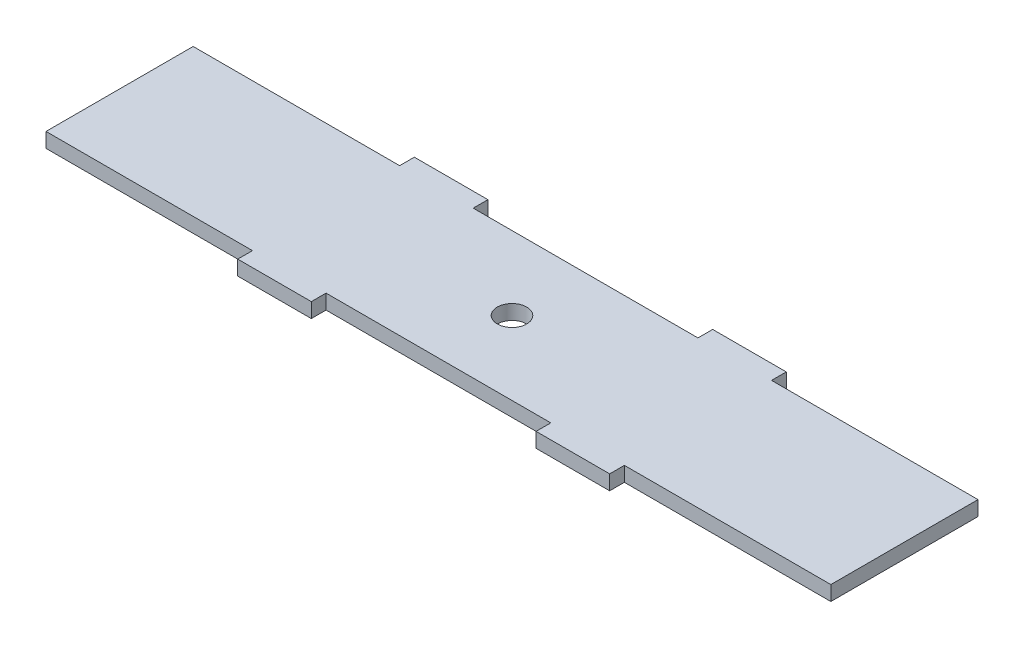
ISO-10303-21;
HEADER;
FILE_DESCRIPTION(('STEP AP214'),'2;1');
FILE_NAME('part.step','',(''),(''),'','','');
FILE_SCHEMA(('AUTOMOTIVE_DESIGN { 1 0 10303 214 1 1 1 1 }'));
ENDSEC;
DATA;
#1=APPLICATION_CONTEXT('core data for automotive mechanical design processes');
#2=APPLICATION_PROTOCOL_DEFINITION('international standard','automotive_design',2000,#1);
#3=PRODUCT_CONTEXT('',#1,'mechanical');
#4=PRODUCT('Part','Part','',(#3));
#5=PRODUCT_RELATED_PRODUCT_CATEGORY('part','',(#4));
#6=PRODUCT_DEFINITION_FORMATION('','',#4);
#7=PRODUCT_DEFINITION_CONTEXT('part definition',#1,'design');
#8=PRODUCT_DEFINITION('design','',#6,#7);
#9=PRODUCT_DEFINITION_SHAPE('','',#8);
#10=(LENGTH_UNIT() NAMED_UNIT(*) SI_UNIT(.MILLI.,.METRE.));
#11=(NAMED_UNIT(*) PLANE_ANGLE_UNIT() SI_UNIT($,.RADIAN.));
#12=(NAMED_UNIT(*) SI_UNIT($,.STERADIAN.) SOLID_ANGLE_UNIT());
#13=UNCERTAINTY_MEASURE_WITH_UNIT(LENGTH_MEASURE(1.E-05),#10,'distance_accuracy_value','');
#14=(GEOMETRIC_REPRESENTATION_CONTEXT(3) GLOBAL_UNCERTAINTY_ASSIGNED_CONTEXT((#13)) GLOBAL_UNIT_ASSIGNED_CONTEXT((#10,
#11,#12)) REPRESENTATION_CONTEXT('',''));
#15=CARTESIAN_POINT('',(0.,0.,0.));
#16=DIRECTION('',(0.,0.,1.));
#17=DIRECTION('',(1.,0.,0.));
#18=AXIS2_PLACEMENT_3D('',#15,#16,#17);
#19=CARTESIAN_POINT('',(0.,3.,0.));
#20=DIRECTION('',(0.,1.,0.));
#21=DIRECTION('',(0.,0.,1.));
#22=AXIS2_PLACEMENT_3D('',#19,#20,#21);
#23=PLANE('',#22);
#24=DIRECTION('',(0.,0.,1.));
#25=VECTOR('',#24,1.);
#26=CARTESIAN_POINT('',(0.,3.,0.));
#27=LINE('',#26,#25);
#28=CARTESIAN_POINT('',(0.,3.,0.));
#29=VERTEX_POINT('',#28);
#30=CARTESIAN_POINT('',(0.,3.,30.));
#31=VERTEX_POINT('',#30);
#32=EDGE_CURVE('E247',#29,#31,#27,.T.);
#33=ORIENTED_EDGE('',*,*,#32,.T.);
#34=DIRECTION('',(1.,0.,0.));
#35=VECTOR('',#34,1.);
#36=CARTESIAN_POINT('',(0.,3.,30.));
#37=LINE('',#36,#35);
#38=CARTESIAN_POINT('',(42.09,3.,30.));
#39=VERTEX_POINT('',#38);
#40=EDGE_CURVE('E135',#31,#39,#37,.T.);
#41=ORIENTED_EDGE('',*,*,#40,.T.);
#42=DIRECTION('',(0.,0.,1.));
#43=VECTOR('',#42,1.);
#44=CARTESIAN_POINT('',(42.09,3.,30.));
#45=LINE('',#44,#43);
#46=CARTESIAN_POINT('',(42.09,3.,33.));
#47=VERTEX_POINT('',#46);
#48=EDGE_CURVE('E298',#39,#47,#45,.T.);
#49=ORIENTED_EDGE('',*,*,#48,.T.);
#50=DIRECTION('',(1.,0.,0.));
#51=VECTOR('',#50,1.);
#52=CARTESIAN_POINT('',(42.09,3.,33.));
#53=LINE('',#52,#51);
#54=CARTESIAN_POINT('',(57.09,3.,33.));
#55=VERTEX_POINT('',#54);
#56=EDGE_CURVE('E317',#47,#55,#53,.T.);
#57=ORIENTED_EDGE('',*,*,#56,.T.);
#58=DIRECTION('',(0.,0.,-1.));
#59=VECTOR('',#58,1.);
#60=CARTESIAN_POINT('',(57.09,3.,30.));
#61=LINE('',#60,#59);
#62=CARTESIAN_POINT('',(57.09,3.,30.));
#63=VERTEX_POINT('',#62);
#64=EDGE_CURVE('E314',#55,#63,#61,.T.);
#65=ORIENTED_EDGE('',*,*,#64,.T.);
#66=DIRECTION('',(1.,0.,0.));
#67=VECTOR('',#66,1.);
#68=CARTESIAN_POINT('',(57.09,3.,30.));
#69=LINE('',#68,#67);
#70=CARTESIAN_POINT('',(102.91,3.,30.));
#71=VERTEX_POINT('',#70);
#72=EDGE_CURVE('E316',#63,#71,#69,.T.);
#73=ORIENTED_EDGE('',*,*,#72,.T.);
#74=DIRECTION('',(0.,0.,1.));
#75=VECTOR('',#74,1.);
#76=CARTESIAN_POINT('',(102.91,3.,30.));
#77=LINE('',#76,#75);
#78=CARTESIAN_POINT('',(102.91,3.,33.));
#79=VERTEX_POINT('',#78);
#80=EDGE_CURVE('E319',#71,#79,#77,.T.);
#81=ORIENTED_EDGE('',*,*,#80,.T.);
#82=DIRECTION('',(1.,0.,0.));
#83=VECTOR('',#82,1.);
#84=CARTESIAN_POINT('',(117.91,3.,33.));
#85=LINE('',#84,#83);
#86=CARTESIAN_POINT('',(117.91,3.,33.));
#87=VERTEX_POINT('',#86);
#88=EDGE_CURVE('E325',#79,#87,#85,.T.);
#89=ORIENTED_EDGE('',*,*,#88,.T.);
#90=DIRECTION('',(0.,0.,-1.));
#91=VECTOR('',#90,1.);
#92=CARTESIAN_POINT('',(117.91,3.,30.));
#93=LINE('',#92,#91);
#94=CARTESIAN_POINT('',(117.91,3.,30.));
#95=VERTEX_POINT('',#94);
#96=EDGE_CURVE('E327',#87,#95,#93,.T.);
#97=ORIENTED_EDGE('',*,*,#96,.T.);
#98=DIRECTION('',(1.,0.,0.));
#99=VECTOR('',#98,1.);
#100=CARTESIAN_POINT('',(117.91,3.,30.));
#101=LINE('',#100,#99);
#102=CARTESIAN_POINT('',(160.,3.,30.));
#103=VERTEX_POINT('',#102);
#104=EDGE_CURVE('E329',#95,#103,#101,.T.);
#105=ORIENTED_EDGE('',*,*,#104,.T.);
#106=DIRECTION('',(0.,0.,-1.));
#107=VECTOR('',#106,1.);
#108=CARTESIAN_POINT('',(160.,3.,0.));
#109=LINE('',#108,#107);
#110=CARTESIAN_POINT('',(160.,3.,0.));
#111=VERTEX_POINT('',#110);
#112=EDGE_CURVE('E331',#103,#111,#109,.T.);
#113=ORIENTED_EDGE('',*,*,#112,.T.);
#114=DIRECTION('',(-1.,0.,0.));
#115=VECTOR('',#114,1.);
#116=CARTESIAN_POINT('',(117.91,3.,0.));
#117=LINE('',#116,#115);
#118=CARTESIAN_POINT('',(117.91,3.,0.));
#119=VERTEX_POINT('',#118);
#120=EDGE_CURVE('E333',#111,#119,#117,.T.);
#121=ORIENTED_EDGE('',*,*,#120,.T.);
#122=DIRECTION('',(0.,0.,-1.));
#123=VECTOR('',#122,1.);
#124=CARTESIAN_POINT('',(117.91,3.,0.));
#125=LINE('',#124,#123);
#126=CARTESIAN_POINT('',(117.91,3.,-3.));
#127=VERTEX_POINT('',#126);
#128=EDGE_CURVE('E335',#119,#127,#125,.T.);
#129=ORIENTED_EDGE('',*,*,#128,.T.);
#130=DIRECTION('',(-1.,0.,0.));
#131=VECTOR('',#130,1.);
#132=CARTESIAN_POINT('',(117.91,3.,-3.));
#133=LINE('',#132,#131);
#134=CARTESIAN_POINT('',(102.91,3.,-3.00000000000001));
#135=VERTEX_POINT('',#134);
#136=EDGE_CURVE('E337',#127,#135,#133,.T.);
#137=ORIENTED_EDGE('',*,*,#136,.T.);
#138=DIRECTION('',(0.,0.,1.));
#139=VECTOR('',#138,1.);
#140=CARTESIAN_POINT('',(102.91,3.,0.));
#141=LINE('',#140,#139);
#142=CARTESIAN_POINT('',(102.91,3.,0.));
#143=VERTEX_POINT('',#142);
#144=EDGE_CURVE('E339',#135,#143,#141,.T.);
#145=ORIENTED_EDGE('',*,*,#144,.T.);
#146=DIRECTION('',(-1.,0.,0.));
#147=VECTOR('',#146,1.);
#148=CARTESIAN_POINT('',(57.09,3.,0.));
#149=LINE('',#148,#147);
#150=CARTESIAN_POINT('',(57.09,3.,0.));
#151=VERTEX_POINT('',#150);
#152=EDGE_CURVE('E341',#143,#151,#149,.T.);
#153=ORIENTED_EDGE('',*,*,#152,.T.);
#154=DIRECTION('',(0.,0.,-1.));
#155=VECTOR('',#154,1.);
#156=CARTESIAN_POINT('',(57.09,3.,0.));
#157=LINE('',#156,#155);
#158=CARTESIAN_POINT('',(57.09,3.,-3.00000000000001));
#159=VERTEX_POINT('',#158);
#160=EDGE_CURVE('E190',#151,#159,#157,.T.);
#161=ORIENTED_EDGE('',*,*,#160,.T.);
#162=DIRECTION('',(-1.,0.,0.));
#163=VECTOR('',#162,1.);
#164=CARTESIAN_POINT('',(42.09,3.,-3.));
#165=LINE('',#164,#163);
#166=CARTESIAN_POINT('',(42.09,3.,-3.));
#167=VERTEX_POINT('',#166);
#168=EDGE_CURVE('E184',#159,#167,#165,.T.);
#169=ORIENTED_EDGE('',*,*,#168,.T.);
#170=DIRECTION('',(0.,0.,1.));
#171=VECTOR('',#170,1.);
#172=CARTESIAN_POINT('',(42.09,3.,0.));
#173=LINE('',#172,#171);
#174=CARTESIAN_POINT('',(42.09,3.,0.));
#175=VERTEX_POINT('',#174);
#176=EDGE_CURVE('E188',#167,#175,#173,.T.);
#177=ORIENTED_EDGE('',*,*,#176,.T.);
#178=DIRECTION('',(-1.,0.,0.));
#179=VECTOR('',#178,1.);
#180=CARTESIAN_POINT('',(0.,3.,0.));
#181=LINE('',#180,#179);
#182=EDGE_CURVE('E56',#175,#29,#181,.T.);
#183=ORIENTED_EDGE('',*,*,#182,.T.);
#184=EDGE_LOOP('',(#33,#41,#49,#57,#65,#73,#81,#89,#97,#105,#113,#121,#129,#137,#145,#153,#161,
#169,#177,#183));
#185=FACE_BOUND('',#184,.T.);
#186=CARTESIAN_POINT('',(80.,3.,15.));
#187=DIRECTION('',(0.,1.,0.));
#188=DIRECTION('',(0.,0.,1.));
#189=AXIS2_PLACEMENT_3D('',#186,#187,#188);
#190=CIRCLE('',#189,3.00000000000001);
#191=CARTESIAN_POINT('',(80.,3.,18.));
#192=VERTEX_POINT('',#191);
#193=EDGE_CURVE('E212',#192,#192,#190,.T.);
#194=ORIENTED_EDGE('',*,*,#193,.F.);
#195=EDGE_LOOP('',(#194));
#196=FACE_BOUND('',#195,.T.);
#197=ADVANCED_FACE('F39',(#185,#196),#23,.T.);
#198=CARTESIAN_POINT('',(0.,0.,0.));
#199=DIRECTION('',(0.,1.,0.));
#200=DIRECTION('',(0.,0.,1.));
#201=AXIS2_PLACEMENT_3D('',#198,#199,#200);
#202=PLANE('',#201);
#203=DIRECTION('',(0.,0.,1.));
#204=VECTOR('',#203,1.);
#205=CARTESIAN_POINT('',(0.,0.,0.));
#206=LINE('',#205,#204);
#207=CARTESIAN_POINT('',(0.,0.,0.));
#208=VERTEX_POINT('',#207);
#209=CARTESIAN_POINT('',(0.,0.,30.));
#210=VERTEX_POINT('',#209);
#211=EDGE_CURVE('E208',#208,#210,#206,.T.);
#212=ORIENTED_EDGE('',*,*,#211,.F.);
#213=DIRECTION('',(-1.,0.,0.));
#214=VECTOR('',#213,1.);
#215=CARTESIAN_POINT('',(0.,0.,0.));
#216=LINE('',#215,#214);
#217=CARTESIAN_POINT('',(42.09,0.,0.));
#218=VERTEX_POINT('',#217);
#219=EDGE_CURVE('E127',#218,#208,#216,.T.);
#220=ORIENTED_EDGE('',*,*,#219,.F.);
#221=DIRECTION('',(0.,0.,1.));
#222=VECTOR('',#221,1.);
#223=CARTESIAN_POINT('',(42.09,0.,0.));
#224=LINE('',#223,#222);
#225=CARTESIAN_POINT('',(42.09,0.,-3.));
#226=VERTEX_POINT('',#225);
#227=EDGE_CURVE('E121',#226,#218,#224,.T.);
#228=ORIENTED_EDGE('',*,*,#227,.F.);
#229=DIRECTION('',(-1.,0.,0.));
#230=VECTOR('',#229,1.);
#231=CARTESIAN_POINT('',(42.09,0.,-3.));
#232=LINE('',#231,#230);
#233=CARTESIAN_POINT('',(57.09,0.,-3.00000000000001));
#234=VERTEX_POINT('',#233);
#235=EDGE_CURVE('E198',#234,#226,#232,.T.);
#236=ORIENTED_EDGE('',*,*,#235,.F.);
#237=DIRECTION('',(0.,0.,-1.));
#238=VECTOR('',#237,1.);
#239=CARTESIAN_POINT('',(57.09,0.,0.));
#240=LINE('',#239,#238);
#241=CARTESIAN_POINT('',(57.09,0.,0.));
#242=VERTEX_POINT('',#241);
#243=EDGE_CURVE('E242',#242,#234,#240,.T.);
#244=ORIENTED_EDGE('',*,*,#243,.F.);
#245=DIRECTION('',(-1.,0.,0.));
#246=VECTOR('',#245,1.);
#247=CARTESIAN_POINT('',(57.09,0.,0.));
#248=LINE('',#247,#246);
#249=CARTESIAN_POINT('',(102.91,0.,0.));
#250=VERTEX_POINT('',#249);
#251=EDGE_CURVE('E240',#250,#242,#248,.T.);
#252=ORIENTED_EDGE('',*,*,#251,.F.);
#253=DIRECTION('',(0.,0.,1.));
#254=VECTOR('',#253,1.);
#255=CARTESIAN_POINT('',(102.91,0.,0.));
#256=LINE('',#255,#254);
#257=CARTESIAN_POINT('',(102.91,0.,-3.00000000000001));
#258=VERTEX_POINT('',#257);
#259=EDGE_CURVE('E238',#258,#250,#256,.T.);
#260=ORIENTED_EDGE('',*,*,#259,.F.);
#261=DIRECTION('',(-1.,0.,0.));
#262=VECTOR('',#261,1.);
#263=CARTESIAN_POINT('',(117.91,0.,-3.));
#264=LINE('',#263,#262);
#265=CARTESIAN_POINT('',(117.91,0.,-3.));
#266=VERTEX_POINT('',#265);
#267=EDGE_CURVE('E236',#266,#258,#264,.T.);
#268=ORIENTED_EDGE('',*,*,#267,.F.);
#269=DIRECTION('',(0.,0.,-1.));
#270=VECTOR('',#269,1.);
#271=CARTESIAN_POINT('',(117.91,0.,0.));
#272=LINE('',#271,#270);
#273=CARTESIAN_POINT('',(117.91,0.,0.));
#274=VERTEX_POINT('',#273);
#275=EDGE_CURVE('E234',#274,#266,#272,.T.);
#276=ORIENTED_EDGE('',*,*,#275,.F.);
#277=DIRECTION('',(-1.,0.,0.));
#278=VECTOR('',#277,1.);
#279=CARTESIAN_POINT('',(117.91,0.,0.));
#280=LINE('',#279,#278);
#281=CARTESIAN_POINT('',(160.,0.,0.));
#282=VERTEX_POINT('',#281);
#283=EDGE_CURVE('E232',#282,#274,#280,.T.);
#284=ORIENTED_EDGE('',*,*,#283,.F.);
#285=DIRECTION('',(0.,0.,-1.));
#286=VECTOR('',#285,1.);
#287=CARTESIAN_POINT('',(160.,0.,0.));
#288=LINE('',#287,#286);
#289=CARTESIAN_POINT('',(160.,0.,30.));
#290=VERTEX_POINT('',#289);
#291=EDGE_CURVE('E230',#290,#282,#288,.T.);
#292=ORIENTED_EDGE('',*,*,#291,.F.);
#293=DIRECTION('',(1.,0.,0.));
#294=VECTOR('',#293,1.);
#295=CARTESIAN_POINT('',(117.91,0.,30.));
#296=LINE('',#295,#294);
#297=CARTESIAN_POINT('',(117.91,0.,30.));
#298=VERTEX_POINT('',#297);
#299=EDGE_CURVE('E228',#298,#290,#296,.T.);
#300=ORIENTED_EDGE('',*,*,#299,.F.);
#301=DIRECTION('',(0.,0.,-1.));
#302=VECTOR('',#301,1.);
#303=CARTESIAN_POINT('',(117.91,0.,30.));
#304=LINE('',#303,#302);
#305=CARTESIAN_POINT('',(117.91,0.,33.));
#306=VERTEX_POINT('',#305);
#307=EDGE_CURVE('E226',#306,#298,#304,.T.);
#308=ORIENTED_EDGE('',*,*,#307,.F.);
#309=DIRECTION('',(1.,0.,0.));
#310=VECTOR('',#309,1.);
#311=CARTESIAN_POINT('',(117.91,0.,33.));
#312=LINE('',#311,#310);
#313=CARTESIAN_POINT('',(102.91,0.,33.));
#314=VERTEX_POINT('',#313);
#315=EDGE_CURVE('E224',#314,#306,#312,.T.);
#316=ORIENTED_EDGE('',*,*,#315,.F.);
#317=DIRECTION('',(0.,0.,1.));
#318=VECTOR('',#317,1.);
#319=CARTESIAN_POINT('',(102.91,0.,30.));
#320=LINE('',#319,#318);
#321=CARTESIAN_POINT('',(102.91,0.,30.));
#322=VERTEX_POINT('',#321);
#323=EDGE_CURVE('E222',#322,#314,#320,.T.);
#324=ORIENTED_EDGE('',*,*,#323,.F.);
#325=DIRECTION('',(1.,0.,0.));
#326=VECTOR('',#325,1.);
#327=CARTESIAN_POINT('',(57.09,0.,30.));
#328=LINE('',#327,#326);
#329=CARTESIAN_POINT('',(57.09,0.,30.));
#330=VERTEX_POINT('',#329);
#331=EDGE_CURVE('E220',#330,#322,#328,.T.);
#332=ORIENTED_EDGE('',*,*,#331,.F.);
#333=DIRECTION('',(0.,0.,-1.));
#334=VECTOR('',#333,1.);
#335=CARTESIAN_POINT('',(57.09,0.,30.));
#336=LINE('',#335,#334);
#337=CARTESIAN_POINT('',(57.09,0.,33.));
#338=VERTEX_POINT('',#337);
#339=EDGE_CURVE('E218',#338,#330,#336,.T.);
#340=ORIENTED_EDGE('',*,*,#339,.F.);
#341=DIRECTION('',(1.,0.,0.));
#342=VECTOR('',#341,1.);
#343=CARTESIAN_POINT('',(42.09,0.,33.));
#344=LINE('',#343,#342);
#345=CARTESIAN_POINT('',(42.09,0.,33.));
#346=VERTEX_POINT('',#345);
#347=EDGE_CURVE('E216',#346,#338,#344,.T.);
#348=ORIENTED_EDGE('',*,*,#347,.F.);
#349=DIRECTION('',(0.,0.,1.));
#350=VECTOR('',#349,1.);
#351=CARTESIAN_POINT('',(42.09,0.,30.));
#352=LINE('',#351,#350);
#353=CARTESIAN_POINT('',(42.09,0.,30.));
#354=VERTEX_POINT('',#353);
#355=EDGE_CURVE('E214',#354,#346,#352,.T.);
#356=ORIENTED_EDGE('',*,*,#355,.F.);
#357=DIRECTION('',(1.,0.,0.));
#358=VECTOR('',#357,1.);
#359=CARTESIAN_POINT('',(0.,0.,30.));
#360=LINE('',#359,#358);
#361=EDGE_CURVE('E211',#210,#354,#360,.T.);
#362=ORIENTED_EDGE('',*,*,#361,.F.);
#363=EDGE_LOOP('',(#212,#220,#228,#236,#244,#252,#260,#268,#276,#284,#292,#300,#308,#316,#324,
#332,#340,#348,#356,#362));
#364=FACE_BOUND('',#363,.T.);
#365=CARTESIAN_POINT('',(80.,0.,15.));
#366=DIRECTION('',(0.,1.,0.));
#367=DIRECTION('',(0.,0.,1.));
#368=AXIS2_PLACEMENT_3D('',#365,#366,#367);
#369=CIRCLE('',#368,3.00000000000001);
#370=CARTESIAN_POINT('',(80.,0.,18.));
#371=VERTEX_POINT('',#370);
#372=EDGE_CURVE('E592',#371,#371,#369,.T.);
#373=ORIENTED_EDGE('',*,*,#372,.T.);
#374=EDGE_LOOP('',(#373));
#375=FACE_BOUND('',#374,.T.);
#376=ADVANCED_FACE('F302',(#364,#375),#202,.F.);
#377=CARTESIAN_POINT('',(0.,3.,0.));
#378=DIRECTION('',(1.,0.,0.));
#379=DIRECTION('',(0.,0.,-1.));
#380=AXIS2_PLACEMENT_3D('',#377,#378,#379);
#381=PLANE('',#380);
#382=ORIENTED_EDGE('',*,*,#211,.T.);
#383=DIRECTION('',(0.,-1.,0.));
#384=VECTOR('',#383,1.);
#385=CARTESIAN_POINT('',(0.,3.,30.));
#386=LINE('',#385,#384);
#387=EDGE_CURVE('E11',#31,#210,#386,.T.);
#388=ORIENTED_EDGE('',*,*,#387,.F.);
#389=ORIENTED_EDGE('',*,*,#32,.F.);
#390=DIRECTION('',(0.,-1.,0.));
#391=VECTOR('',#390,1.);
#392=CARTESIAN_POINT('',(0.,3.,0.));
#393=LINE('',#392,#391);
#394=EDGE_CURVE('E204',#29,#208,#393,.T.);
#395=ORIENTED_EDGE('',*,*,#394,.T.);
#396=EDGE_LOOP('',(#382,#388,#389,#395));
#397=FACE_BOUND('',#396,.T.);
#398=ADVANCED_FACE('F41',(#397),#381,.F.);
#399=CARTESIAN_POINT('',(0.,3.,30.));
#400=DIRECTION('',(0.,0.,-1.));
#401=DIRECTION('',(-1.,0.,0.));
#402=AXIS2_PLACEMENT_3D('',#399,#400,#401);
#403=PLANE('',#402);
#404=ORIENTED_EDGE('',*,*,#361,.T.);
#405=DIRECTION('',(0.,-1.,0.));
#406=VECTOR('',#405,1.);
#407=CARTESIAN_POINT('',(42.09,3.,30.));
#408=LINE('',#407,#406);
#409=EDGE_CURVE('E48',#39,#354,#408,.T.);
#410=ORIENTED_EDGE('',*,*,#409,.F.);
#411=ORIENTED_EDGE('',*,*,#40,.F.);
#412=ORIENTED_EDGE('',*,*,#387,.T.);
#413=EDGE_LOOP('',(#404,#410,#411,#412));
#414=FACE_BOUND('',#413,.T.);
#415=ADVANCED_FACE('F375',(#414),#403,.F.);
#416=CARTESIAN_POINT('',(42.09,3.,30.));
#417=DIRECTION('',(1.,0.,0.));
#418=DIRECTION('',(0.,0.,-1.));
#419=AXIS2_PLACEMENT_3D('',#416,#417,#418);
#420=PLANE('',#419);
#421=ORIENTED_EDGE('',*,*,#355,.T.);
#422=DIRECTION('',(0.,-1.,0.));
#423=VECTOR('',#422,1.);
#424=CARTESIAN_POINT('',(42.09,3.,33.));
#425=LINE('',#424,#423);
#426=EDGE_CURVE('E290',#47,#346,#425,.T.);
#427=ORIENTED_EDGE('',*,*,#426,.F.);
#428=ORIENTED_EDGE('',*,*,#48,.F.);
#429=ORIENTED_EDGE('',*,*,#409,.T.);
#430=EDGE_LOOP('',(#421,#427,#428,#429));
#431=FACE_BOUND('',#430,.T.);
#432=ADVANCED_FACE('F296',(#431),#420,.F.);
#433=CARTESIAN_POINT('',(42.09,3.,33.));
#434=DIRECTION('',(0.,0.,-1.));
#435=DIRECTION('',(-1.,0.,0.));
#436=AXIS2_PLACEMENT_3D('',#433,#434,#435);
#437=PLANE('',#436);
#438=ORIENTED_EDGE('',*,*,#347,.T.);
#439=DIRECTION('',(0.,-1.,0.));
#440=VECTOR('',#439,1.);
#441=CARTESIAN_POINT('',(57.09,3.,33.));
#442=LINE('',#441,#440);
#443=EDGE_CURVE('E287',#55,#338,#442,.T.);
#444=ORIENTED_EDGE('',*,*,#443,.F.);
#445=ORIENTED_EDGE('',*,*,#56,.F.);
#446=ORIENTED_EDGE('',*,*,#426,.T.);
#447=EDGE_LOOP('',(#438,#444,#445,#446));
#448=FACE_BOUND('',#447,.T.);
#449=ADVANCED_FACE('F308',(#448),#437,.F.);
#450=CARTESIAN_POINT('',(57.09,3.,30.));
#451=DIRECTION('',(-1.,0.,0.));
#452=DIRECTION('',(0.,0.,1.));
#453=AXIS2_PLACEMENT_3D('',#450,#451,#452);
#454=PLANE('',#453);
#455=ORIENTED_EDGE('',*,*,#339,.T.);
#456=DIRECTION('',(0.,-1.,0.));
#457=VECTOR('',#456,1.);
#458=CARTESIAN_POINT('',(57.09,3.,30.));
#459=LINE('',#458,#457);
#460=EDGE_CURVE('E284',#63,#330,#459,.T.);
#461=ORIENTED_EDGE('',*,*,#460,.F.);
#462=ORIENTED_EDGE('',*,*,#64,.F.);
#463=ORIENTED_EDGE('',*,*,#443,.T.);
#464=EDGE_LOOP('',(#455,#461,#462,#463));
#465=FACE_BOUND('',#464,.T.);
#466=ADVANCED_FACE('F312',(#465),#454,.F.);
#467=CARTESIAN_POINT('',(57.09,3.,30.));
#468=DIRECTION('',(0.,0.,-1.));
#469=DIRECTION('',(-1.,0.,0.));
#470=AXIS2_PLACEMENT_3D('',#467,#468,#469);
#471=PLANE('',#470);
#472=ORIENTED_EDGE('',*,*,#331,.T.);
#473=DIRECTION('',(0.,-1.,0.));
#474=VECTOR('',#473,1.);
#475=CARTESIAN_POINT('',(102.91,3.,30.));
#476=LINE('',#475,#474);
#477=EDGE_CURVE('E281',#71,#322,#476,.T.);
#478=ORIENTED_EDGE('',*,*,#477,.F.);
#479=ORIENTED_EDGE('',*,*,#72,.F.);
#480=ORIENTED_EDGE('',*,*,#460,.T.);
#481=EDGE_LOOP('',(#472,#478,#479,#480));
#482=FACE_BOUND('',#481,.T.);
#483=ADVANCED_FACE('F388',(#482),#471,.F.);
#484=CARTESIAN_POINT('',(102.91,3.,30.));
#485=DIRECTION('',(1.,0.,0.));
#486=DIRECTION('',(0.,0.,-1.));
#487=AXIS2_PLACEMENT_3D('',#484,#485,#486);
#488=PLANE('',#487);
#489=ORIENTED_EDGE('',*,*,#323,.T.);
#490=DIRECTION('',(0.,-1.,0.));
#491=VECTOR('',#490,1.);
#492=CARTESIAN_POINT('',(102.91,3.,33.));
#493=LINE('',#492,#491);
#494=EDGE_CURVE('E278',#79,#314,#493,.T.);
#495=ORIENTED_EDGE('',*,*,#494,.F.);
#496=ORIENTED_EDGE('',*,*,#80,.F.);
#497=ORIENTED_EDGE('',*,*,#477,.T.);
#498=EDGE_LOOP('',(#489,#495,#496,#497));
#499=FACE_BOUND('',#498,.T.);
#500=ADVANCED_FACE('F391',(#499),#488,.F.);
#501=CARTESIAN_POINT('',(117.91,3.,33.));
#502=DIRECTION('',(0.,0.,-1.));
#503=DIRECTION('',(-1.,0.,0.));
#504=AXIS2_PLACEMENT_3D('',#501,#502,#503);
#505=PLANE('',#504);
#506=ORIENTED_EDGE('',*,*,#315,.T.);
#507=DIRECTION('',(0.,-1.,0.));
#508=VECTOR('',#507,1.);
#509=CARTESIAN_POINT('',(117.91,3.,33.));
#510=LINE('',#509,#508);
#511=EDGE_CURVE('E275',#87,#306,#510,.T.);
#512=ORIENTED_EDGE('',*,*,#511,.F.);
#513=ORIENTED_EDGE('',*,*,#88,.F.);
#514=ORIENTED_EDGE('',*,*,#494,.T.);
#515=EDGE_LOOP('',(#506,#512,#513,#514));
#516=FACE_BOUND('',#515,.T.);
#517=ADVANCED_FACE('F395',(#516),#505,.F.);
#518=CARTESIAN_POINT('',(117.91,3.,30.));
#519=DIRECTION('',(-1.,0.,0.));
#520=DIRECTION('',(0.,0.,1.));
#521=AXIS2_PLACEMENT_3D('',#518,#519,#520);
#522=PLANE('',#521);
#523=ORIENTED_EDGE('',*,*,#307,.T.);
#524=DIRECTION('',(0.,-1.,0.));
#525=VECTOR('',#524,1.);
#526=CARTESIAN_POINT('',(117.91,3.,30.));
#527=LINE('',#526,#525);
#528=EDGE_CURVE('E272',#95,#298,#527,.T.);
#529=ORIENTED_EDGE('',*,*,#528,.F.);
#530=ORIENTED_EDGE('',*,*,#96,.F.);
#531=ORIENTED_EDGE('',*,*,#511,.T.);
#532=EDGE_LOOP('',(#523,#529,#530,#531));
#533=FACE_BOUND('',#532,.T.);
#534=ADVANCED_FACE('F399',(#533),#522,.F.);
#535=CARTESIAN_POINT('',(117.91,3.,30.));
#536=DIRECTION('',(0.,0.,-1.));
#537=DIRECTION('',(-1.,0.,0.));
#538=AXIS2_PLACEMENT_3D('',#535,#536,#537);
#539=PLANE('',#538);
#540=ORIENTED_EDGE('',*,*,#299,.T.);
#541=DIRECTION('',(0.,-1.,0.));
#542=VECTOR('',#541,1.);
#543=CARTESIAN_POINT('',(160.,3.,30.));
#544=LINE('',#543,#542);
#545=EDGE_CURVE('E269',#103,#290,#544,.T.);
#546=ORIENTED_EDGE('',*,*,#545,.F.);
#547=ORIENTED_EDGE('',*,*,#104,.F.);
#548=ORIENTED_EDGE('',*,*,#528,.T.);
#549=EDGE_LOOP('',(#540,#546,#547,#548));
#550=FACE_BOUND('',#549,.T.);
#551=ADVANCED_FACE('F403',(#550),#539,.F.);
#552=CARTESIAN_POINT('',(160.,3.,0.));
#553=DIRECTION('',(-1.,0.,0.));
#554=DIRECTION('',(0.,0.,1.));
#555=AXIS2_PLACEMENT_3D('',#552,#553,#554);
#556=PLANE('',#555);
#557=ORIENTED_EDGE('',*,*,#291,.T.);
#558=DIRECTION('',(0.,-1.,0.));
#559=VECTOR('',#558,1.);
#560=CARTESIAN_POINT('',(160.,3.,0.));
#561=LINE('',#560,#559);
#562=EDGE_CURVE('E266',#111,#282,#561,.T.);
#563=ORIENTED_EDGE('',*,*,#562,.F.);
#564=ORIENTED_EDGE('',*,*,#112,.F.);
#565=ORIENTED_EDGE('',*,*,#545,.T.);
#566=EDGE_LOOP('',(#557,#563,#564,#565));
#567=FACE_BOUND('',#566,.T.);
#568=ADVANCED_FACE('F407',(#567),#556,.F.);
#569=CARTESIAN_POINT('',(117.91,3.,0.));
#570=DIRECTION('',(0.,0.,1.));
#571=DIRECTION('',(1.,0.,0.));
#572=AXIS2_PLACEMENT_3D('',#569,#570,#571);
#573=PLANE('',#572);
#574=ORIENTED_EDGE('',*,*,#283,.T.);
#575=DIRECTION('',(0.,-1.,0.));
#576=VECTOR('',#575,1.);
#577=CARTESIAN_POINT('',(117.91,3.,0.));
#578=LINE('',#577,#576);
#579=EDGE_CURVE('E263',#119,#274,#578,.T.);
#580=ORIENTED_EDGE('',*,*,#579,.F.);
#581=ORIENTED_EDGE('',*,*,#120,.F.);
#582=ORIENTED_EDGE('',*,*,#562,.T.);
#583=EDGE_LOOP('',(#574,#580,#581,#582));
#584=FACE_BOUND('',#583,.T.);
#585=ADVANCED_FACE('F411',(#584),#573,.F.);
#586=CARTESIAN_POINT('',(117.91,3.,0.));
#587=DIRECTION('',(-1.,0.,0.));
#588=DIRECTION('',(0.,0.,1.));
#589=AXIS2_PLACEMENT_3D('',#586,#587,#588);
#590=PLANE('',#589);
#591=ORIENTED_EDGE('',*,*,#275,.T.);
#592=DIRECTION('',(0.,-1.,0.));
#593=VECTOR('',#592,1.);
#594=CARTESIAN_POINT('',(117.91,3.,-3.));
#595=LINE('',#594,#593);
#596=EDGE_CURVE('E260',#127,#266,#595,.T.);
#597=ORIENTED_EDGE('',*,*,#596,.F.);
#598=ORIENTED_EDGE('',*,*,#128,.F.);
#599=ORIENTED_EDGE('',*,*,#579,.T.);
#600=EDGE_LOOP('',(#591,#597,#598,#599));
#601=FACE_BOUND('',#600,.T.);
#602=ADVANCED_FACE('F415',(#601),#590,.F.);
#603=CARTESIAN_POINT('',(117.91,3.,-3.));
#604=DIRECTION('',(0.,0.,1.));
#605=DIRECTION('',(1.,0.,0.));
#606=AXIS2_PLACEMENT_3D('',#603,#604,#605);
#607=PLANE('',#606);
#608=ORIENTED_EDGE('',*,*,#267,.T.);
#609=DIRECTION('',(0.,-1.,0.));
#610=VECTOR('',#609,1.);
#611=CARTESIAN_POINT('',(102.91,3.,-3.00000000000001));
#612=LINE('',#611,#610);
#613=EDGE_CURVE('E257',#135,#258,#612,.T.);
#614=ORIENTED_EDGE('',*,*,#613,.F.);
#615=ORIENTED_EDGE('',*,*,#136,.F.);
#616=ORIENTED_EDGE('',*,*,#596,.T.);
#617=EDGE_LOOP('',(#608,#614,#615,#616));
#618=FACE_BOUND('',#617,.T.);
#619=ADVANCED_FACE('F419',(#618),#607,.F.);
#620=CARTESIAN_POINT('',(102.91,3.,0.));
#621=DIRECTION('',(1.,0.,0.));
#622=DIRECTION('',(0.,0.,-1.));
#623=AXIS2_PLACEMENT_3D('',#620,#621,#622);
#624=PLANE('',#623);
#625=ORIENTED_EDGE('',*,*,#259,.T.);
#626=DIRECTION('',(0.,-1.,0.));
#627=VECTOR('',#626,1.);
#628=CARTESIAN_POINT('',(102.91,3.,0.));
#629=LINE('',#628,#627);
#630=EDGE_CURVE('E254',#143,#250,#629,.T.);
#631=ORIENTED_EDGE('',*,*,#630,.F.);
#632=ORIENTED_EDGE('',*,*,#144,.F.);
#633=ORIENTED_EDGE('',*,*,#613,.T.);
#634=EDGE_LOOP('',(#625,#631,#632,#633));
#635=FACE_BOUND('',#634,.T.);
#636=ADVANCED_FACE('F423',(#635),#624,.F.);
#637=CARTESIAN_POINT('',(57.09,3.,0.));
#638=DIRECTION('',(0.,0.,1.));
#639=DIRECTION('',(1.,0.,0.));
#640=AXIS2_PLACEMENT_3D('',#637,#638,#639);
#641=PLANE('',#640);
#642=ORIENTED_EDGE('',*,*,#251,.T.);
#643=DIRECTION('',(0.,-1.,0.));
#644=VECTOR('',#643,1.);
#645=CARTESIAN_POINT('',(57.09,3.,0.));
#646=LINE('',#645,#644);
#647=EDGE_CURVE('E251',#151,#242,#646,.T.);
#648=ORIENTED_EDGE('',*,*,#647,.F.);
#649=ORIENTED_EDGE('',*,*,#152,.F.);
#650=ORIENTED_EDGE('',*,*,#630,.T.);
#651=EDGE_LOOP('',(#642,#648,#649,#650));
#652=FACE_BOUND('',#651,.T.);
#653=ADVANCED_FACE('F347',(#652),#641,.F.);
#654=CARTESIAN_POINT('',(57.09,3.,0.));
#655=DIRECTION('',(-1.,0.,0.));
#656=DIRECTION('',(0.,0.,1.));
#657=AXIS2_PLACEMENT_3D('',#654,#655,#656);
#658=PLANE('',#657);
#659=ORIENTED_EDGE('',*,*,#243,.T.);
#660=DIRECTION('',(0.,-1.,0.));
#661=VECTOR('',#660,1.);
#662=CARTESIAN_POINT('',(57.09,3.,-3.00000000000001));
#663=LINE('',#662,#661);
#664=EDGE_CURVE('E199',#159,#234,#663,.T.);
#665=ORIENTED_EDGE('',*,*,#664,.F.);
#666=ORIENTED_EDGE('',*,*,#160,.F.);
#667=ORIENTED_EDGE('',*,*,#647,.T.);
#668=EDGE_LOOP('',(#659,#665,#666,#667));
#669=FACE_BOUND('',#668,.T.);
#670=ADVANCED_FACE('F351',(#669),#658,.F.);
#671=CARTESIAN_POINT('',(42.09,3.,-3.));
#672=DIRECTION('',(0.,0.,1.));
#673=DIRECTION('',(1.,0.,0.));
#674=AXIS2_PLACEMENT_3D('',#671,#672,#673);
#675=PLANE('',#674);
#676=ORIENTED_EDGE('',*,*,#235,.T.);
#677=DIRECTION('',(0.,-1.,0.));
#678=VECTOR('',#677,1.);
#679=CARTESIAN_POINT('',(42.09,3.,-3.));
#680=LINE('',#679,#678);
#681=EDGE_CURVE('E195',#167,#226,#680,.T.);
#682=ORIENTED_EDGE('',*,*,#681,.F.);
#683=ORIENTED_EDGE('',*,*,#168,.F.);
#684=ORIENTED_EDGE('',*,*,#664,.T.);
#685=EDGE_LOOP('',(#676,#682,#683,#684));
#686=FACE_BOUND('',#685,.T.);
#687=ADVANCED_FACE('F196',(#686),#675,.F.);
#688=CARTESIAN_POINT('',(42.09,3.,0.));
#689=DIRECTION('',(1.,0.,0.));
#690=DIRECTION('',(0.,0.,-1.));
#691=AXIS2_PLACEMENT_3D('',#688,#689,#690);
#692=PLANE('',#691);
#693=ORIENTED_EDGE('',*,*,#227,.T.);
#694=DIRECTION('',(0.,-1.,0.));
#695=VECTOR('',#694,1.);
#696=CARTESIAN_POINT('',(42.09,3.,0.));
#697=LINE('',#696,#695);
#698=EDGE_CURVE('E200',#175,#218,#697,.T.);
#699=ORIENTED_EDGE('',*,*,#698,.F.);
#700=ORIENTED_EDGE('',*,*,#176,.F.);
#701=ORIENTED_EDGE('',*,*,#681,.T.);
#702=EDGE_LOOP('',(#693,#699,#700,#701));
#703=FACE_BOUND('',#702,.T.);
#704=ADVANCED_FACE('F202',(#703),#692,.F.);
#705=CARTESIAN_POINT('',(0.,3.,0.));
#706=DIRECTION('',(0.,0.,1.));
#707=DIRECTION('',(1.,0.,0.));
#708=AXIS2_PLACEMENT_3D('',#705,#706,#707);
#709=PLANE('',#708);
#710=ORIENTED_EDGE('',*,*,#219,.T.);
#711=ORIENTED_EDGE('',*,*,#394,.F.);
#712=ORIENTED_EDGE('',*,*,#182,.F.);
#713=ORIENTED_EDGE('',*,*,#698,.T.);
#714=EDGE_LOOP('',(#710,#711,#712,#713));
#715=FACE_BOUND('',#714,.T.);
#716=ADVANCED_FACE('F355',(#715),#709,.F.);
#717=CARTESIAN_POINT('',(80.,3.,15.));
#718=DIRECTION('',(0.,-1.,0.));
#719=DIRECTION('',(0.,0.,-1.));
#720=AXIS2_PLACEMENT_3D('',#717,#718,#719);
#721=CYLINDRICAL_SURFACE('',#720,3.00000000000001);
#722=ORIENTED_EDGE('',*,*,#193,.T.);
#723=EDGE_LOOP('',(#722));
#724=FACE_BOUND('',#723,.T.);
#725=ORIENTED_EDGE('',*,*,#372,.F.);
#726=EDGE_LOOP('',(#725));
#727=FACE_BOUND('',#726,.T.);
#728=ADVANCED_FACE('F357',(#724,#727),#721,.F.);
#729=CLOSED_SHELL('',(#197,#376,#398,#415,#432,#449,#466,#483,#500,#517,#534,#551,#568,#585,
#602,#619,#636,#653,#670,#687,#704,#716,#728));
#730=MANIFOLD_SOLID_BREP('B2',#729);
#731=ADVANCED_BREP_SHAPE_REPRESENTATION('',(#18,#730),#14);
#732=SHAPE_DEFINITION_REPRESENTATION(#9,#731);
ENDSEC;
END-ISO-10303-21;
